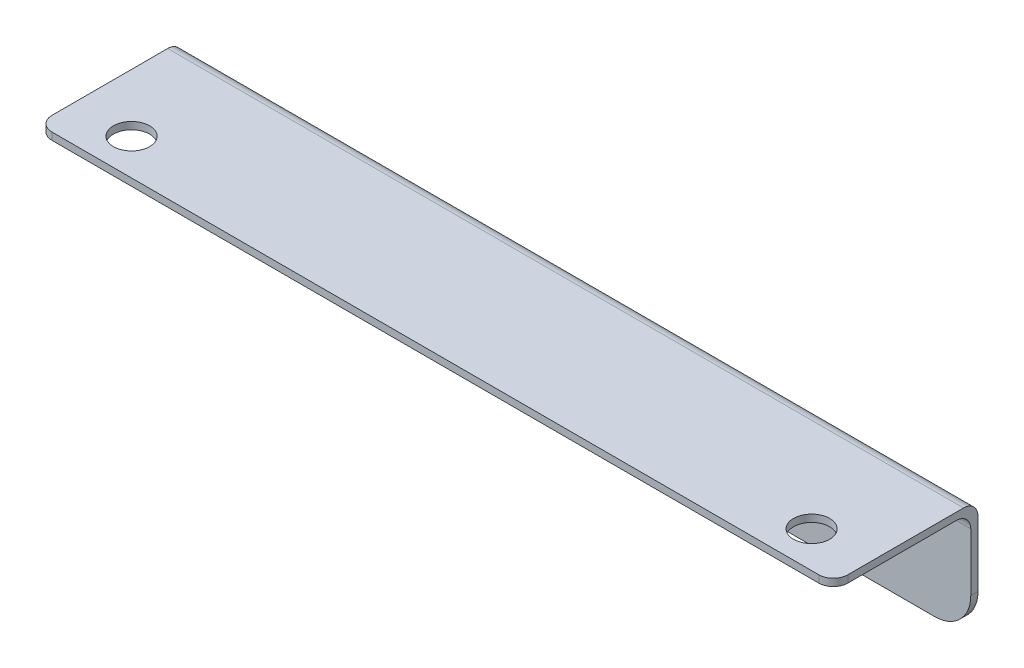
ISO-10303-21;
HEADER;
FILE_DESCRIPTION(('STEP AP214'),'2;1');
FILE_NAME('part.step','',(''),(''),'','','');
FILE_SCHEMA(('AUTOMOTIVE_DESIGN { 1 0 10303 214 1 1 1 1 }'));
ENDSEC;
DATA;
#1=APPLICATION_CONTEXT('core data for automotive mechanical design processes');
#2=APPLICATION_PROTOCOL_DEFINITION('international standard','automotive_design',2000,#1);
#3=PRODUCT_CONTEXT('',#1,'mechanical');
#4=PRODUCT('Part','Part','',(#3));
#5=PRODUCT_RELATED_PRODUCT_CATEGORY('part','',(#4));
#6=PRODUCT_DEFINITION_FORMATION('','',#4);
#7=PRODUCT_DEFINITION_CONTEXT('part definition',#1,'design');
#8=PRODUCT_DEFINITION('design','',#6,#7);
#9=PRODUCT_DEFINITION_SHAPE('','',#8);
#10=(LENGTH_UNIT() NAMED_UNIT(*) SI_UNIT(.MILLI.,.METRE.));
#11=(NAMED_UNIT(*) PLANE_ANGLE_UNIT() SI_UNIT($,.RADIAN.));
#12=(NAMED_UNIT(*) SI_UNIT($,.STERADIAN.) SOLID_ANGLE_UNIT());
#13=UNCERTAINTY_MEASURE_WITH_UNIT(LENGTH_MEASURE(1.E-05),#10,'distance_accuracy_value','');
#14=(GEOMETRIC_REPRESENTATION_CONTEXT(3) GLOBAL_UNCERTAINTY_ASSIGNED_CONTEXT((#13)) GLOBAL_UNIT_ASSIGNED_CONTEXT((#10,
#11,#12)) REPRESENTATION_CONTEXT('',''));
#15=CARTESIAN_POINT('',(0.,0.,0.));
#16=DIRECTION('',(0.,0.,1.));
#17=DIRECTION('',(1.,0.,0.));
#18=AXIS2_PLACEMENT_3D('',#15,#16,#17);
#19=CARTESIAN_POINT('',(-50.,-10.,1.));
#20=DIRECTION('',(0.,0.,-1.));
#21=DIRECTION('',(-1.,0.,0.));
#22=AXIS2_PLACEMENT_3D('',#19,#20,#21);
#23=PLANE('',#22);
#24=DIRECTION('',(0.,1.,0.));
#25=VECTOR('',#24,1.);
#26=CARTESIAN_POINT('',(55.,0.,1.));
#27=LINE('',#26,#25);
#28=CARTESIAN_POINT('',(55.,-9.99999999999997,1.));
#29=VERTEX_POINT('',#28);
#30=CARTESIAN_POINT('',(55.,-2.,1.));
#31=VERTEX_POINT('',#30);
#32=EDGE_CURVE('E153',#29,#31,#27,.T.);
#33=ORIENTED_EDGE('',*,*,#32,.T.);
#34=DIRECTION('',(-1.,0.,0.));
#35=VECTOR('',#34,1.);
#36=CARTESIAN_POINT('',(-55.,-2.,1.));
#37=LINE('',#36,#35);
#38=CARTESIAN_POINT('',(-55.,-2.,1.));
#39=VERTEX_POINT('',#38);
#40=EDGE_CURVE('E126',#31,#39,#37,.T.);
#41=ORIENTED_EDGE('',*,*,#40,.T.);
#42=DIRECTION('',(0.,-1.,0.));
#43=VECTOR('',#42,1.);
#44=CARTESIAN_POINT('',(-55.,0.,1.));
#45=LINE('',#44,#43);
#46=CARTESIAN_POINT('',(-55.,-9.99999999999996,1.));
#47=VERTEX_POINT('',#46);
#48=EDGE_CURVE('E120',#39,#47,#45,.T.);
#49=ORIENTED_EDGE('',*,*,#48,.T.);
#50=CARTESIAN_POINT('',(-50.,-10.,1.));
#51=DIRECTION('',(0.,0.,1.));
#52=DIRECTION('',(-1.,0.,0.));
#53=AXIS2_PLACEMENT_3D('',#50,#51,#52);
#54=CIRCLE('',#53,5.);
#55=CARTESIAN_POINT('',(-50.,-15.,1.));
#56=VERTEX_POINT('',#55);
#57=EDGE_CURVE('E124',#47,#56,#54,.T.);
#58=ORIENTED_EDGE('',*,*,#57,.T.);
#59=DIRECTION('',(1.,0.,0.));
#60=VECTOR('',#59,1.);
#61=CARTESIAN_POINT('',(-50.,-15.,1.));
#62=LINE('',#61,#60);
#63=CARTESIAN_POINT('',(50.,-15.,1.));
#64=VERTEX_POINT('',#63);
#65=EDGE_CURVE('E137',#56,#64,#62,.T.);
#66=ORIENTED_EDGE('',*,*,#65,.T.);
#67=CARTESIAN_POINT('',(50.,-10.,1.));
#68=DIRECTION('',(0.,0.,1.));
#69=DIRECTION('',(1.,0.,0.));
#70=AXIS2_PLACEMENT_3D('',#67,#68,#69);
#71=CIRCLE('',#70,5.);
#72=EDGE_CURVE('E244',#64,#29,#71,.T.);
#73=ORIENTED_EDGE('',*,*,#72,.T.);
#74=EDGE_LOOP('',(#33,#41,#49,#58,#66,#73));
#75=FACE_BOUND('',#74,.T.);
#76=CARTESIAN_POINT('',(40.,-7.5,1.));
#77=DIRECTION('',(0.,0.,1.));
#78=DIRECTION('',(1.,0.,0.));
#79=AXIS2_PLACEMENT_3D('',#76,#77,#78);
#80=CIRCLE('',#79,3.);
#81=CARTESIAN_POINT('',(43.,-7.5,1.));
#82=VERTEX_POINT('',#81);
#83=EDGE_CURVE('E238',#82,#82,#80,.T.);
#84=ORIENTED_EDGE('',*,*,#83,.F.);
#85=EDGE_LOOP('',(#84));
#86=FACE_BOUND('',#85,.T.);
#87=CARTESIAN_POINT('',(-40.,-7.50000000000001,1.));
#88=DIRECTION('',(0.,0.,1.));
#89=DIRECTION('',(-1.,0.,0.));
#90=AXIS2_PLACEMENT_3D('',#87,#88,#89);
#91=CIRCLE('',#90,3.);
#92=CARTESIAN_POINT('',(-43.,-7.50000000000001,1.));
#93=VERTEX_POINT('',#92);
#94=EDGE_CURVE('E231',#93,#93,#91,.T.);
#95=ORIENTED_EDGE('',*,*,#94,.F.);
#96=EDGE_LOOP('',(#95));
#97=FACE_BOUND('',#96,.T.);
#98=ADVANCED_FACE('F33',(#75,#86,#97),#23,.F.);
#99=CARTESIAN_POINT('',(-50.,-10.,0.));
#100=DIRECTION('',(0.,0.,-1.));
#101=DIRECTION('',(-1.,0.,0.));
#102=AXIS2_PLACEMENT_3D('',#99,#100,#101);
#103=PLANE('',#102);
#104=CARTESIAN_POINT('',(40.,-7.5,0.));
#105=DIRECTION('',(0.,0.,1.));
#106=DIRECTION('',(1.,0.,0.));
#107=AXIS2_PLACEMENT_3D('',#104,#105,#106);
#108=CIRCLE('',#107,3.);
#109=CARTESIAN_POINT('',(43.,-7.5,0.));
#110=VERTEX_POINT('',#109);
#111=EDGE_CURVE('E235',#110,#110,#108,.T.);
#112=ORIENTED_EDGE('',*,*,#111,.T.);
#113=EDGE_LOOP('',(#112));
#114=FACE_BOUND('',#113,.T.);
#115=DIRECTION('',(0.,-1.,0.));
#116=VECTOR('',#115,1.);
#117=CARTESIAN_POINT('',(-55.,0.,0.));
#118=LINE('',#117,#116);
#119=CARTESIAN_POINT('',(-55.,-1.,0.));
#120=VERTEX_POINT('',#119);
#121=CARTESIAN_POINT('',(-55.,-9.99999999999996,0.));
#122=VERTEX_POINT('',#121);
#123=EDGE_CURVE('E141',#120,#122,#118,.T.);
#124=ORIENTED_EDGE('',*,*,#123,.F.);
#125=DIRECTION('',(-1.,0.,0.));
#126=VECTOR('',#125,1.);
#127=CARTESIAN_POINT('',(-50.,-1.,0.));
#128=LINE('',#127,#126);
#129=CARTESIAN_POINT('',(55.,-1.,0.));
#130=VERTEX_POINT('',#129);
#131=EDGE_CURVE('E163',#120,#130,#128,.F.);
#132=ORIENTED_EDGE('',*,*,#131,.T.);
#133=DIRECTION('',(0.,1.,0.));
#134=VECTOR('',#133,1.);
#135=CARTESIAN_POINT('',(55.,0.,0.));
#136=LINE('',#135,#134);
#137=CARTESIAN_POINT('',(55.,-9.99999999999997,0.));
#138=VERTEX_POINT('',#137);
#139=EDGE_CURVE('E128',#138,#130,#136,.T.);
#140=ORIENTED_EDGE('',*,*,#139,.F.);
#141=CARTESIAN_POINT('',(50.,-10.,0.));
#142=DIRECTION('',(0.,0.,1.));
#143=DIRECTION('',(1.,0.,0.));
#144=AXIS2_PLACEMENT_3D('',#141,#142,#143);
#145=CIRCLE('',#144,5.);
#146=CARTESIAN_POINT('',(50.,-15.,0.));
#147=VERTEX_POINT('',#146);
#148=EDGE_CURVE('E251',#147,#138,#145,.T.);
#149=ORIENTED_EDGE('',*,*,#148,.F.);
#150=DIRECTION('',(1.,0.,0.));
#151=VECTOR('',#150,1.);
#152=CARTESIAN_POINT('',(-50.,-15.,0.));
#153=LINE('',#152,#151);
#154=CARTESIAN_POINT('',(-50.,-15.,0.));
#155=VERTEX_POINT('',#154);
#156=EDGE_CURVE('E249',#155,#147,#153,.T.);
#157=ORIENTED_EDGE('',*,*,#156,.F.);
#158=CARTESIAN_POINT('',(-50.,-10.,0.));
#159=DIRECTION('',(0.,0.,1.));
#160=DIRECTION('',(-1.,0.,0.));
#161=AXIS2_PLACEMENT_3D('',#158,#159,#160);
#162=CIRCLE('',#161,5.);
#163=EDGE_CURVE('E247',#122,#155,#162,.T.);
#164=ORIENTED_EDGE('',*,*,#163,.F.);
#165=EDGE_LOOP('',(#124,#132,#140,#149,#157,#164));
#166=FACE_BOUND('',#165,.T.);
#167=CARTESIAN_POINT('',(-40.,-7.50000000000001,0.));
#168=DIRECTION('',(0.,0.,1.));
#169=DIRECTION('',(-1.,0.,0.));
#170=AXIS2_PLACEMENT_3D('',#167,#168,#169);
#171=CIRCLE('',#170,3.);
#172=CARTESIAN_POINT('',(-43.,-7.50000000000001,0.));
#173=VERTEX_POINT('',#172);
#174=EDGE_CURVE('E216',#173,#173,#171,.T.);
#175=ORIENTED_EDGE('',*,*,#174,.T.);
#176=EDGE_LOOP('',(#175));
#177=FACE_BOUND('',#176,.T.);
#178=ADVANCED_FACE('F267',(#114,#166,#177),#103,.T.);
#179=CARTESIAN_POINT('',(-55.,0.,1.));
#180=DIRECTION('',(1.,0.,0.));
#181=DIRECTION('',(0.,1.,0.));
#182=AXIS2_PLACEMENT_3D('',#179,#180,#181);
#183=PLANE('',#182);
#184=DIRECTION('',(0.,0.,1.));
#185=VECTOR('',#184,1.);
#186=CARTESIAN_POINT('',(-55.,0.,0.));
#187=LINE('',#186,#185);
#188=CARTESIAN_POINT('',(-55.,0.,3.));
#189=VERTEX_POINT('',#188);
#190=CARTESIAN_POINT('',(-55.,0.,18.));
#191=VERTEX_POINT('',#190);
#192=EDGE_CURVE('E165',#189,#191,#187,.T.);
#193=ORIENTED_EDGE('',*,*,#192,.T.);
#194=DIRECTION('',(0.,-1.,0.));
#195=VECTOR('',#194,1.);
#196=CARTESIAN_POINT('',(-55.,0.,18.));
#197=LINE('',#196,#195);
#198=CARTESIAN_POINT('',(-55.,1.,18.));
#199=VERTEX_POINT('',#198);
#200=EDGE_CURVE('E160',#191,#199,#197,.F.);
#201=ORIENTED_EDGE('',*,*,#200,.T.);
#202=DIRECTION('',(0.,0.,1.));
#203=VECTOR('',#202,1.);
#204=CARTESIAN_POINT('',(-55.,1.,0.));
#205=LINE('',#204,#203);
#206=CARTESIAN_POINT('',(-55.,1.,2.));
#207=VERTEX_POINT('',#206);
#208=EDGE_CURVE('E225',#207,#199,#205,.T.);
#209=ORIENTED_EDGE('',*,*,#208,.F.);
#210=CARTESIAN_POINT('',(-55.,-1.,2.));
#211=DIRECTION('',(1.,0.,0.));
#212=DIRECTION('',(0.,1.,0.));
#213=AXIS2_PLACEMENT_3D('',#210,#211,#212);
#214=CIRCLE('',#213,2.);
#215=EDGE_CURVE('E55',#207,#120,#214,.F.);
#216=ORIENTED_EDGE('',*,*,#215,.T.);
#217=ORIENTED_EDGE('',*,*,#123,.T.);
#218=DIRECTION('',(0.,0.,-1.));
#219=VECTOR('',#218,1.);
#220=CARTESIAN_POINT('',(-55.,-9.99999999999996,1.));
#221=LINE('',#220,#219);
#222=EDGE_CURVE('E133',#47,#122,#221,.T.);
#223=ORIENTED_EDGE('',*,*,#222,.F.);
#224=ORIENTED_EDGE('',*,*,#48,.F.);
#225=CARTESIAN_POINT('',(-55.,-2.,3.));
#226=DIRECTION('',(1.,0.,0.));
#227=DIRECTION('',(0.,1.,0.));
#228=AXIS2_PLACEMENT_3D('',#225,#226,#227);
#229=CIRCLE('',#228,2.);
#230=EDGE_CURVE('E41',#39,#189,#229,.T.);
#231=ORIENTED_EDGE('',*,*,#230,.T.);
#232=EDGE_LOOP('',(#193,#201,#209,#216,#217,#223,#224,#231));
#233=FACE_BOUND('',#232,.T.);
#234=ADVANCED_FACE('F140',(#233),#183,.F.);
#235=CARTESIAN_POINT('',(-50.,-10.,1.));
#236=DIRECTION('',(0.,0.,-1.));
#237=DIRECTION('',(-1.,0.,0.));
#238=AXIS2_PLACEMENT_3D('',#235,#236,#237);
#239=CYLINDRICAL_SURFACE('',#238,5.);
#240=ORIENTED_EDGE('',*,*,#163,.T.);
#241=DIRECTION('',(0.,0.,-1.));
#242=VECTOR('',#241,1.);
#243=CARTESIAN_POINT('',(-50.,-15.,1.));
#244=LINE('',#243,#242);
#245=EDGE_CURVE('E135',#56,#155,#244,.T.);
#246=ORIENTED_EDGE('',*,*,#245,.F.);
#247=ORIENTED_EDGE('',*,*,#57,.F.);
#248=ORIENTED_EDGE('',*,*,#222,.T.);
#249=EDGE_LOOP('',(#240,#246,#247,#248));
#250=FACE_BOUND('',#249,.T.);
#251=ADVANCED_FACE('F132',(#250),#239,.T.);
#252=CARTESIAN_POINT('',(-50.,-15.,1.));
#253=DIRECTION('',(0.,1.,0.));
#254=DIRECTION('',(-1.,0.,0.));
#255=AXIS2_PLACEMENT_3D('',#252,#253,#254);
#256=PLANE('',#255);
#257=ORIENTED_EDGE('',*,*,#156,.T.);
#258=DIRECTION('',(0.,0.,-1.));
#259=VECTOR('',#258,1.);
#260=CARTESIAN_POINT('',(50.,-15.,1.));
#261=LINE('',#260,#259);
#262=EDGE_CURVE('E147',#64,#147,#261,.T.);
#263=ORIENTED_EDGE('',*,*,#262,.F.);
#264=ORIENTED_EDGE('',*,*,#65,.F.);
#265=ORIENTED_EDGE('',*,*,#245,.T.);
#266=EDGE_LOOP('',(#257,#263,#264,#265));
#267=FACE_BOUND('',#266,.T.);
#268=ADVANCED_FACE('F316',(#267),#256,.F.);
#269=CARTESIAN_POINT('',(50.,-10.,1.));
#270=DIRECTION('',(0.,0.,-1.));
#271=DIRECTION('',(-1.,0.,0.));
#272=AXIS2_PLACEMENT_3D('',#269,#270,#271);
#273=CYLINDRICAL_SURFACE('',#272,5.);
#274=ORIENTED_EDGE('',*,*,#148,.T.);
#275=DIRECTION('',(0.,0.,-1.));
#276=VECTOR('',#275,1.);
#277=CARTESIAN_POINT('',(55.,-9.99999999999997,1.));
#278=LINE('',#277,#276);
#279=EDGE_CURVE('E254',#29,#138,#278,.T.);
#280=ORIENTED_EDGE('',*,*,#279,.F.);
#281=ORIENTED_EDGE('',*,*,#72,.F.);
#282=ORIENTED_EDGE('',*,*,#262,.T.);
#283=EDGE_LOOP('',(#274,#280,#281,#282));
#284=FACE_BOUND('',#283,.T.);
#285=ADVANCED_FACE('F261',(#284),#273,.T.);
#286=CARTESIAN_POINT('',(55.,0.,1.));
#287=DIRECTION('',(-1.,0.,0.));
#288=DIRECTION('',(0.,-1.,0.));
#289=AXIS2_PLACEMENT_3D('',#286,#287,#288);
#290=PLANE('',#289);
#291=DIRECTION('',(0.,0.,-1.));
#292=VECTOR('',#291,1.);
#293=CARTESIAN_POINT('',(55.,1.,0.));
#294=LINE('',#293,#292);
#295=CARTESIAN_POINT('',(55.,1.,18.));
#296=VERTEX_POINT('',#295);
#297=CARTESIAN_POINT('',(55.,1.,2.));
#298=VERTEX_POINT('',#297);
#299=EDGE_CURVE('E206',#296,#298,#294,.T.);
#300=ORIENTED_EDGE('',*,*,#299,.F.);
#301=DIRECTION('',(0.,-1.,0.));
#302=VECTOR('',#301,1.);
#303=CARTESIAN_POINT('',(55.,0.,18.));
#304=LINE('',#303,#302);
#305=CARTESIAN_POINT('',(55.,0.,18.));
#306=VERTEX_POINT('',#305);
#307=EDGE_CURVE('E145',#296,#306,#304,.T.);
#308=ORIENTED_EDGE('',*,*,#307,.T.);
#309=DIRECTION('',(0.,0.,-1.));
#310=VECTOR('',#309,1.);
#311=CARTESIAN_POINT('',(55.,0.,0.));
#312=LINE('',#311,#310);
#313=CARTESIAN_POINT('',(55.,0.,3.));
#314=VERTEX_POINT('',#313);
#315=EDGE_CURVE('E220',#306,#314,#312,.T.);
#316=ORIENTED_EDGE('',*,*,#315,.T.);
#317=CARTESIAN_POINT('',(55.,-2.,3.));
#318=DIRECTION('',(-1.,0.,0.));
#319=DIRECTION('',(0.,-1.,0.));
#320=AXIS2_PLACEMENT_3D('',#317,#318,#319);
#321=CIRCLE('',#320,2.);
#322=EDGE_CURVE('E11',#314,#31,#321,.T.);
#323=ORIENTED_EDGE('',*,*,#322,.T.);
#324=ORIENTED_EDGE('',*,*,#32,.F.);
#325=ORIENTED_EDGE('',*,*,#279,.T.);
#326=ORIENTED_EDGE('',*,*,#139,.T.);
#327=CARTESIAN_POINT('',(55.,-1.,2.));
#328=DIRECTION('',(-1.,0.,0.));
#329=DIRECTION('',(0.,-1.,0.));
#330=AXIS2_PLACEMENT_3D('',#327,#328,#329);
#331=CIRCLE('',#330,2.);
#332=EDGE_CURVE('E143',#130,#298,#331,.F.);
#333=ORIENTED_EDGE('',*,*,#332,.T.);
#334=EDGE_LOOP('',(#300,#308,#316,#323,#324,#325,#326,#333));
#335=FACE_BOUND('',#334,.T.);
#336=ADVANCED_FACE('F213',(#335),#290,.F.);
#337=CARTESIAN_POINT('',(40.,-7.5,1.));
#338=DIRECTION('',(0.,0.,-1.));
#339=DIRECTION('',(-1.,0.,0.));
#340=AXIS2_PLACEMENT_3D('',#337,#338,#339);
#341=CYLINDRICAL_SURFACE('',#340,3.);
#342=ORIENTED_EDGE('',*,*,#83,.T.);
#343=EDGE_LOOP('',(#342));
#344=FACE_BOUND('',#343,.T.);
#345=ORIENTED_EDGE('',*,*,#111,.F.);
#346=EDGE_LOOP('',(#345));
#347=FACE_BOUND('',#346,.T.);
#348=ADVANCED_FACE('F298',(#344,#347),#341,.F.);
#349=CARTESIAN_POINT('',(-40.,-7.50000000000001,1.));
#350=DIRECTION('',(0.,0.,-1.));
#351=DIRECTION('',(-1.,0.,0.));
#352=AXIS2_PLACEMENT_3D('',#349,#350,#351);
#353=CYLINDRICAL_SURFACE('',#352,3.);
#354=ORIENTED_EDGE('',*,*,#94,.T.);
#355=EDGE_LOOP('',(#354));
#356=FACE_BOUND('',#355,.T.);
#357=ORIENTED_EDGE('',*,*,#174,.F.);
#358=EDGE_LOOP('',(#357));
#359=FACE_BOUND('',#358,.T.);
#360=ADVANCED_FACE('F290',(#356,#359),#353,.F.);
#361=CARTESIAN_POINT('',(0.,1.,0.));
#362=DIRECTION('',(0.,1.,0.));
#363=DIRECTION('',(0.,0.,1.));
#364=AXIS2_PLACEMENT_3D('',#361,#362,#363);
#365=PLANE('',#364);
#366=CARTESIAN_POINT('',(47.,1.,15.));
#367=DIRECTION('',(0.,1.,0.));
#368=DIRECTION('',(0.,0.,1.));
#369=AXIS2_PLACEMENT_3D('',#366,#367,#368);
#370=CIRCLE('',#369,2.5);
#371=CARTESIAN_POINT('',(47.,1.,17.5));
#372=VERTEX_POINT('',#371);
#373=EDGE_CURVE('E176',#372,#372,#370,.T.);
#374=ORIENTED_EDGE('',*,*,#373,.F.);
#375=EDGE_LOOP('',(#374));
#376=FACE_BOUND('',#375,.T.);
#377=DIRECTION('',(1.,0.,0.));
#378=VECTOR('',#377,1.);
#379=CARTESIAN_POINT('',(-55.,1.,20.));
#380=LINE('',#379,#378);
#381=CARTESIAN_POINT('',(-53.,1.,20.));
#382=VERTEX_POINT('',#381);
#383=CARTESIAN_POINT('',(53.,1.,20.));
#384=VERTEX_POINT('',#383);
#385=EDGE_CURVE('E208',#382,#384,#380,.T.);
#386=ORIENTED_EDGE('',*,*,#385,.T.);
#387=CARTESIAN_POINT('',(53.,1.,18.));
#388=DIRECTION('',(0.,1.,0.));
#389=DIRECTION('',(0.,0.,1.));
#390=AXIS2_PLACEMENT_3D('',#387,#388,#389);
#391=CIRCLE('',#390,2.);
#392=EDGE_CURVE('E157',#384,#296,#391,.T.);
#393=ORIENTED_EDGE('',*,*,#392,.T.);
#394=ORIENTED_EDGE('',*,*,#299,.T.);
#395=DIRECTION('',(-1.,0.,0.));
#396=VECTOR('',#395,1.);
#397=CARTESIAN_POINT('',(0.,1.,2.));
#398=LINE('',#397,#396);
#399=EDGE_CURVE('E193',#298,#207,#398,.T.);
#400=ORIENTED_EDGE('',*,*,#399,.T.);
#401=ORIENTED_EDGE('',*,*,#208,.T.);
#402=CARTESIAN_POINT('',(-53.,1.,18.));
#403=DIRECTION('',(0.,1.,0.));
#404=DIRECTION('',(0.,0.,1.));
#405=AXIS2_PLACEMENT_3D('',#402,#403,#404);
#406=CIRCLE('',#405,2.);
#407=EDGE_CURVE('E195',#199,#382,#406,.T.);
#408=ORIENTED_EDGE('',*,*,#407,.T.);
#409=EDGE_LOOP('',(#386,#393,#394,#400,#401,#408));
#410=FACE_BOUND('',#409,.T.);
#411=CARTESIAN_POINT('',(-47.,1.,15.));
#412=DIRECTION('',(0.,1.,0.));
#413=DIRECTION('',(0.,0.,-1.));
#414=AXIS2_PLACEMENT_3D('',#411,#412,#413);
#415=CIRCLE('',#414,2.5);
#416=CARTESIAN_POINT('',(-47.,1.,12.5));
#417=VERTEX_POINT('',#416);
#418=EDGE_CURVE('E278',#417,#417,#415,.T.);
#419=ORIENTED_EDGE('',*,*,#418,.F.);
#420=EDGE_LOOP('',(#419));
#421=FACE_BOUND('',#420,.T.);
#422=ADVANCED_FACE('F204',(#376,#410,#421),#365,.T.);
#423=CARTESIAN_POINT('',(0.,0.,0.));
#424=DIRECTION('',(0.,1.,0.));
#425=DIRECTION('',(0.,0.,1.));
#426=AXIS2_PLACEMENT_3D('',#423,#424,#425);
#427=PLANE('',#426);
#428=ORIENTED_EDGE('',*,*,#315,.F.);
#429=CARTESIAN_POINT('',(53.,0.,18.));
#430=DIRECTION('',(0.,1.,0.));
#431=DIRECTION('',(0.,0.,1.));
#432=AXIS2_PLACEMENT_3D('',#429,#430,#431);
#433=CIRCLE('',#432,2.);
#434=CARTESIAN_POINT('',(53.,0.,20.));
#435=VERTEX_POINT('',#434);
#436=EDGE_CURVE('E181',#306,#435,#433,.F.);
#437=ORIENTED_EDGE('',*,*,#436,.T.);
#438=DIRECTION('',(1.,0.,0.));
#439=VECTOR('',#438,1.);
#440=CARTESIAN_POINT('',(-55.,0.,20.));
#441=LINE('',#440,#439);
#442=CARTESIAN_POINT('',(-53.,0.,20.));
#443=VERTEX_POINT('',#442);
#444=EDGE_CURVE('E175',#443,#435,#441,.T.);
#445=ORIENTED_EDGE('',*,*,#444,.F.);
#446=CARTESIAN_POINT('',(-53.,0.,18.));
#447=DIRECTION('',(0.,1.,0.));
#448=DIRECTION('',(0.,0.,1.));
#449=AXIS2_PLACEMENT_3D('',#446,#447,#448);
#450=CIRCLE('',#449,2.);
#451=EDGE_CURVE('E174',#443,#191,#450,.F.);
#452=ORIENTED_EDGE('',*,*,#451,.T.);
#453=ORIENTED_EDGE('',*,*,#192,.F.);
#454=DIRECTION('',(-1.,0.,0.));
#455=VECTOR('',#454,1.);
#456=CARTESIAN_POINT('',(55.,0.,3.));
#457=LINE('',#456,#455);
#458=EDGE_CURVE('E171',#189,#314,#457,.F.);
#459=ORIENTED_EDGE('',*,*,#458,.T.);
#460=EDGE_LOOP('',(#428,#437,#445,#452,#453,#459));
#461=FACE_BOUND('',#460,.T.);
#462=CARTESIAN_POINT('',(47.,0.,15.));
#463=DIRECTION('',(0.,1.,0.));
#464=DIRECTION('',(0.,0.,1.));
#465=AXIS2_PLACEMENT_3D('',#462,#463,#464);
#466=CIRCLE('',#465,2.5);
#467=CARTESIAN_POINT('',(47.,0.,17.5));
#468=VERTEX_POINT('',#467);
#469=EDGE_CURVE('E275',#468,#468,#466,.T.);
#470=ORIENTED_EDGE('',*,*,#469,.T.);
#471=EDGE_LOOP('',(#470));
#472=FACE_BOUND('',#471,.T.);
#473=CARTESIAN_POINT('',(-47.,0.,15.));
#474=DIRECTION('',(0.,1.,0.));
#475=DIRECTION('',(0.,0.,-1.));
#476=AXIS2_PLACEMENT_3D('',#473,#474,#475);
#477=CIRCLE('',#476,2.5);
#478=CARTESIAN_POINT('',(-47.,0.,12.5));
#479=VERTEX_POINT('',#478);
#480=EDGE_CURVE('E281',#479,#479,#477,.T.);
#481=ORIENTED_EDGE('',*,*,#480,.T.);
#482=EDGE_LOOP('',(#481));
#483=FACE_BOUND('',#482,.T.);
#484=ADVANCED_FACE('F169',(#461,#472,#483),#427,.F.);
#485=CARTESIAN_POINT('',(-55.,1.,20.));
#486=DIRECTION('',(0.,0.,-1.));
#487=DIRECTION('',(-1.,0.,0.));
#488=AXIS2_PLACEMENT_3D('',#485,#486,#487);
#489=PLANE('',#488);
#490=ORIENTED_EDGE('',*,*,#444,.T.);
#491=DIRECTION('',(0.,-1.,0.));
#492=VECTOR('',#491,1.);
#493=CARTESIAN_POINT('',(53.,0.999999999999925,20.));
#494=LINE('',#493,#492);
#495=EDGE_CURVE('E191',#435,#384,#494,.F.);
#496=ORIENTED_EDGE('',*,*,#495,.T.);
#497=ORIENTED_EDGE('',*,*,#385,.F.);
#498=DIRECTION('',(0.,-1.,0.));
#499=VECTOR('',#498,1.);
#500=CARTESIAN_POINT('',(-53.,0.999999999999999,20.));
#501=LINE('',#500,#499);
#502=EDGE_CURVE('E188',#382,#443,#501,.T.);
#503=ORIENTED_EDGE('',*,*,#502,.T.);
#504=EDGE_LOOP('',(#490,#496,#497,#503));
#505=FACE_BOUND('',#504,.T.);
#506=ADVANCED_FACE('F222',(#505),#489,.F.);
#507=CARTESIAN_POINT('',(47.,1.,15.));
#508=DIRECTION('',(0.,-1.,0.));
#509=DIRECTION('',(0.,0.,-1.));
#510=AXIS2_PLACEMENT_3D('',#507,#508,#509);
#511=CYLINDRICAL_SURFACE('',#510,2.5);
#512=ORIENTED_EDGE('',*,*,#373,.T.);
#513=EDGE_LOOP('',(#512));
#514=FACE_BOUND('',#513,.T.);
#515=ORIENTED_EDGE('',*,*,#469,.F.);
#516=EDGE_LOOP('',(#515));
#517=FACE_BOUND('',#516,.T.);
#518=ADVANCED_FACE('F361',(#514,#517),#511,.F.);
#519=CARTESIAN_POINT('',(-47.,1.,15.));
#520=DIRECTION('',(0.,-1.,0.));
#521=DIRECTION('',(0.,0.,-1.));
#522=AXIS2_PLACEMENT_3D('',#519,#520,#521);
#523=CYLINDRICAL_SURFACE('',#522,2.5);
#524=ORIENTED_EDGE('',*,*,#418,.T.);
#525=EDGE_LOOP('',(#524));
#526=FACE_BOUND('',#525,.T.);
#527=ORIENTED_EDGE('',*,*,#480,.F.);
#528=EDGE_LOOP('',(#527));
#529=FACE_BOUND('',#528,.T.);
#530=ADVANCED_FACE('F287',(#526,#529),#523,.F.);
#531=CARTESIAN_POINT('',(53.,0.,18.));
#532=DIRECTION('',(0.,-1.,0.));
#533=DIRECTION('',(1.,0.,0.));
#534=AXIS2_PLACEMENT_3D('',#531,#532,#533);
#535=CYLINDRICAL_SURFACE('',#534,2.);
#536=ORIENTED_EDGE('',*,*,#392,.F.);
#537=ORIENTED_EDGE('',*,*,#495,.F.);
#538=ORIENTED_EDGE('',*,*,#436,.F.);
#539=ORIENTED_EDGE('',*,*,#307,.F.);
#540=EDGE_LOOP('',(#536,#537,#538,#539));
#541=FACE_BOUND('',#540,.T.);
#542=ADVANCED_FACE('F218',(#541),#535,.T.);
#543=CARTESIAN_POINT('',(-53.,0.999999999999999,18.));
#544=DIRECTION('',(0.,-1.,0.));
#545=DIRECTION('',(1.,0.,0.));
#546=AXIS2_PLACEMENT_3D('',#543,#544,#545);
#547=CYLINDRICAL_SURFACE('',#546,2.);
#548=ORIENTED_EDGE('',*,*,#407,.F.);
#549=ORIENTED_EDGE('',*,*,#200,.F.);
#550=ORIENTED_EDGE('',*,*,#451,.F.);
#551=ORIENTED_EDGE('',*,*,#502,.F.);
#552=EDGE_LOOP('',(#548,#549,#550,#551));
#553=FACE_BOUND('',#552,.T.);
#554=ADVANCED_FACE('F325',(#553),#547,.T.);
#555=CARTESIAN_POINT('',(-50.,-2.,3.));
#556=DIRECTION('',(1.,0.,0.));
#557=DIRECTION('',(0.,0.,-1.));
#558=AXIS2_PLACEMENT_3D('',#555,#556,#557);
#559=CYLINDRICAL_SURFACE('',#558,2.);
#560=ORIENTED_EDGE('',*,*,#322,.F.);
#561=ORIENTED_EDGE('',*,*,#458,.F.);
#562=ORIENTED_EDGE('',*,*,#230,.F.);
#563=ORIENTED_EDGE('',*,*,#40,.F.);
#564=EDGE_LOOP('',(#560,#561,#562,#563));
#565=FACE_BOUND('',#564,.T.);
#566=ADVANCED_FACE('F179',(#565),#559,.F.);
#567=CARTESIAN_POINT('',(0.,-1.,2.));
#568=DIRECTION('',(-1.,0.,0.));
#569=DIRECTION('',(0.,0.,1.));
#570=AXIS2_PLACEMENT_3D('',#567,#568,#569);
#571=CYLINDRICAL_SURFACE('',#570,2.);
#572=ORIENTED_EDGE('',*,*,#332,.F.);
#573=ORIENTED_EDGE('',*,*,#131,.F.);
#574=ORIENTED_EDGE('',*,*,#215,.F.);
#575=ORIENTED_EDGE('',*,*,#399,.F.);
#576=EDGE_LOOP('',(#572,#573,#574,#575));
#577=FACE_BOUND('',#576,.T.);
#578=ADVANCED_FACE('F35',(#577),#571,.T.);
#579=CLOSED_SHELL('',(#98,#178,#234,#251,#268,#285,#336,#348,#360,#422,#484,#506,#518,#530,#542,
#554,#566,#578));
#580=MANIFOLD_SOLID_BREP('B2',#579);
#581=ADVANCED_BREP_SHAPE_REPRESENTATION('',(#18,#580),#14);
#582=SHAPE_DEFINITION_REPRESENTATION(#9,#581);
ENDSEC;
END-ISO-10303-21;
